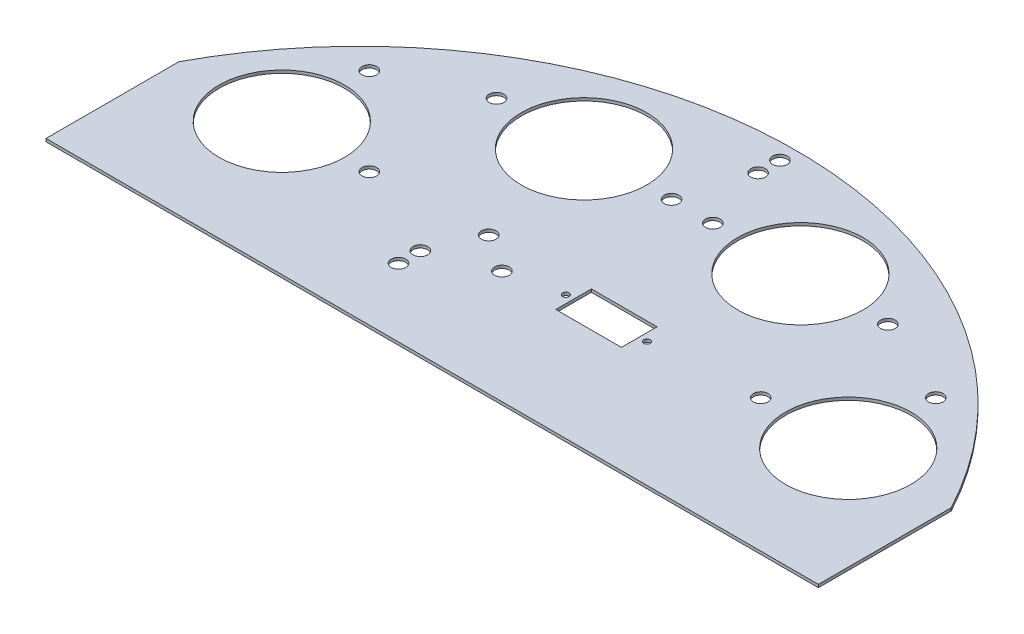
ISO-10303-21;
HEADER;
FILE_DESCRIPTION(('STEP AP214'),'2;1');
FILE_NAME('part.step','',(''),(''),'','','');
FILE_SCHEMA(('AUTOMOTIVE_DESIGN { 1 0 10303 214 1 1 1 1 }'));
ENDSEC;
DATA;
#1=APPLICATION_CONTEXT('core data for automotive mechanical design processes');
#2=APPLICATION_PROTOCOL_DEFINITION('international standard','automotive_design',2000,#1);
#3=PRODUCT_CONTEXT('',#1,'mechanical');
#4=PRODUCT('Part','Part','',(#3));
#5=PRODUCT_RELATED_PRODUCT_CATEGORY('part','',(#4));
#6=PRODUCT_DEFINITION_FORMATION('','',#4);
#7=PRODUCT_DEFINITION_CONTEXT('part definition',#1,'design');
#8=PRODUCT_DEFINITION('design','',#6,#7);
#9=PRODUCT_DEFINITION_SHAPE('','',#8);
#10=(LENGTH_UNIT() NAMED_UNIT(*) SI_UNIT(.MILLI.,.METRE.));
#11=(NAMED_UNIT(*) PLANE_ANGLE_UNIT() SI_UNIT($,.RADIAN.));
#12=(NAMED_UNIT(*) SI_UNIT($,.STERADIAN.) SOLID_ANGLE_UNIT());
#13=UNCERTAINTY_MEASURE_WITH_UNIT(LENGTH_MEASURE(1.E-05),#10,'distance_accuracy_value','');
#14=(GEOMETRIC_REPRESENTATION_CONTEXT(3) GLOBAL_UNCERTAINTY_ASSIGNED_CONTEXT((#13)) GLOBAL_UNIT_ASSIGNED_CONTEXT((#10,
#11,#12)) REPRESENTATION_CONTEXT('',''));
#15=CARTESIAN_POINT('',(0.,0.,0.));
#16=DIRECTION('',(0.,0.,1.));
#17=DIRECTION('',(1.,0.,0.));
#18=AXIS2_PLACEMENT_3D('',#15,#16,#17);
#19=CARTESIAN_POINT('',(0.,0.,0.));
#20=DIRECTION('',(0.,1.,0.));
#21=DIRECTION('',(0.,0.,1.));
#22=AXIS2_PLACEMENT_3D('',#19,#20,#21);
#23=PLANE('',#22);
#24=CARTESIAN_POINT('',(3.27642308215726,0.,-23.7231603295577));
#25=DIRECTION('',(0.,-1.,0.));
#26=DIRECTION('',(0.,0.,-1.));
#27=AXIS2_PLACEMENT_3D('',#24,#25,#26);
#28=CIRCLE('',#27,1.1);
#29=CARTESIAN_POINT('',(3.27642308215726,0.,-24.8231603295577));
#30=VERTEX_POINT('',#29);
#31=EDGE_CURVE('E121',#30,#30,#28,.T.);
#32=ORIENTED_EDGE('',*,*,#31,.F.);
#33=EDGE_LOOP('',(#32));
#34=FACE_BOUND('',#33,.T.);
#35=CARTESIAN_POINT('',(31.0764230821573,0.,-23.7231603295648));
#36=DIRECTION('',(0.,-1.,0.));
#37=DIRECTION('',(0.,0.,-1.));
#38=AXIS2_PLACEMENT_3D('',#35,#36,#37);
#39=CIRCLE('',#38,1.1);
#40=CARTESIAN_POINT('',(31.0764230821573,0.,-24.8231603295648));
#41=VERTEX_POINT('',#40);
#42=EDGE_CURVE('E536',#41,#41,#39,.T.);
#43=ORIENTED_EDGE('',*,*,#42,.F.);
#44=EDGE_LOOP('',(#43));
#45=FACE_BOUND('',#44,.T.);
#46=CARTESIAN_POINT('',(0.0264230821546131,0.,-100.361328531609));
#47=DIRECTION('',(0.,-1.,0.));
#48=DIRECTION('',(0.,0.,-1.));
#49=AXIS2_PLACEMENT_3D('',#46,#47,#48);
#50=CIRCLE('',#49,2.5);
#51=CARTESIAN_POINT('',(0.0264230821546131,0.,-102.861328531609));
#52=VERTEX_POINT('',#51);
#53=EDGE_CURVE('E530',#52,#52,#50,.T.);
#54=ORIENTED_EDGE('',*,*,#53,.F.);
#55=EDGE_LOOP('',(#54));
#56=FACE_BOUND('',#55,.T.);
#57=CARTESIAN_POINT('',(0.0313088597263741,0.,-92.861330122997));
#58=DIRECTION('',(0.,-1.,0.));
#59=DIRECTION('',(0.,0.,-1.));
#60=AXIS2_PLACEMENT_3D('',#57,#58,#59);
#61=CIRCLE('',#60,2.5);
#62=CARTESIAN_POINT('',(0.0313088597263741,0.,-95.361330122997));
#63=VERTEX_POINT('',#62);
#64=EDGE_CURVE('E524',#63,#63,#61,.T.);
#65=ORIENTED_EDGE('',*,*,#64,.F.);
#66=EDGE_LOOP('',(#65));
#67=FACE_BOUND('',#66,.T.);
#68=CARTESIAN_POINT('',(-34.7470971556567,0.,-4.37316032956778));
#69=DIRECTION('',(0.,-1.,0.));
#70=DIRECTION('',(0.,0.,-1.));
#71=AXIS2_PLACEMENT_3D('',#68,#69,#70);
#72=CIRCLE('',#71,2.49999999999871);
#73=CARTESIAN_POINT('',(-34.7470971556567,0.,-6.87316032956649));
#74=VERTEX_POINT('',#73);
#75=EDGE_CURVE('E518',#74,#74,#72,.T.);
#76=ORIENTED_EDGE('',*,*,#75,.F.);
#77=EDGE_LOOP('',(#76));
#78=FACE_BOUND('',#77,.T.);
#79=CARTESIAN_POINT('',(-34.7470971556569,0.,-11.8731603295678));
#80=DIRECTION('',(0.,-1.,0.));
#81=DIRECTION('',(0.,0.,-1.));
#82=AXIS2_PLACEMENT_3D('',#79,#80,#81);
#83=CIRCLE('',#82,2.49999999999872);
#84=CARTESIAN_POINT('',(-34.7470971556569,0.,-14.3731603295665));
#85=VERTEX_POINT('',#84);
#86=EDGE_CURVE('E512',#85,#85,#83,.T.);
#87=ORIENTED_EDGE('',*,*,#86,.F.);
#88=EDGE_LOOP('',(#87));
#89=FACE_BOUND('',#88,.T.);
#90=CARTESIAN_POINT('',(-14.7000794528065,0.,-19.7948636798147));
#91=DIRECTION('',(0.,-1.,0.));
#92=DIRECTION('',(0.,0.,-1.));
#93=AXIS2_PLACEMENT_3D('',#90,#91,#92);
#94=CIRCLE('',#93,2.5);
#95=CARTESIAN_POINT('',(-14.7000794528065,0.,-22.2948636798147));
#96=VERTEX_POINT('',#95);
#97=EDGE_CURVE('E504',#96,#96,#94,.T.);
#98=ORIENTED_EDGE('',*,*,#97,.F.);
#99=EDGE_LOOP('',(#98));
#100=FACE_BOUND('',#99,.T.);
#101=CARTESIAN_POINT('',(-27.6878652168352,0.,-28.2546166873023));
#102=DIRECTION('',(0.,-1.,0.));
#103=DIRECTION('',(0.,0.,-1.));
#104=AXIS2_PLACEMENT_3D('',#101,#102,#103);
#105=CIRCLE('',#104,2.5);
#106=CARTESIAN_POINT('',(-27.6878652168352,0.,-30.7546166873023));
#107=VERTEX_POINT('',#106);
#108=EDGE_CURVE('E498',#107,#107,#105,.T.);
#109=ORIENTED_EDGE('',*,*,#108,.F.);
#110=EDGE_LOOP('',(#109));
#111=FACE_BOUND('',#110,.T.);
#112=CARTESIAN_POINT('',(97.237534512333,0.,-56.561617597691));
#113=DIRECTION('',(0.,-1.,0.));
#114=DIRECTION('',(0.,0.,-1.));
#115=AXIS2_PLACEMENT_3D('',#112,#113,#114);
#116=CIRCLE('',#115,2.49999999999999);
#117=CARTESIAN_POINT('',(97.237534512333,0.,-59.061617597691));
#118=VERTEX_POINT('',#117);
#119=EDGE_CURVE('E134',#118,#118,#116,.T.);
#120=ORIENTED_EDGE('',*,*,#119,.F.);
#121=EDGE_LOOP('',(#120));
#122=FACE_BOUND('',#121,.T.);
#123=CARTESIAN_POINT('',(97.237534512333,0.,-26.561617597691));
#124=DIRECTION('',(0.,1.,0.));
#125=DIRECTION('',(0.,0.,1.));
#126=AXIS2_PLACEMENT_3D('',#123,#124,#125);
#127=CIRCLE('',#126,21.5);
#128=CARTESIAN_POINT('',(97.237534512333,0.,-5.06161759769103));
#129=VERTEX_POINT('',#128);
#130=EDGE_CURVE('E189',#129,#129,#127,.T.);
#131=ORIENTED_EDGE('',*,*,#130,.T.);
#132=EDGE_LOOP('',(#131));
#133=FACE_BOUND('',#132,.T.);
#134=CARTESIAN_POINT('',(37.2375345123306,0.,-70.1541692780098));
#135=DIRECTION('',(0.,1.,0.));
#136=DIRECTION('',(0.,0.,1.));
#137=AXIS2_PLACEMENT_3D('',#134,#135,#136);
#138=CIRCLE('',#137,21.5);
#139=CARTESIAN_POINT('',(37.2375345123306,0.,-48.6541692780098));
#140=VERTEX_POINT('',#139);
#141=EDGE_CURVE('E226',#140,#140,#138,.T.);
#142=ORIENTED_EDGE('',*,*,#141,.T.);
#143=EDGE_LOOP('',(#142));
#144=FACE_BOUND('',#143,.T.);
#145=CARTESIAN_POINT('',(-36.926544137657,0.,-70.1541692780059));
#146=DIRECTION('',(0.,1.,0.));
#147=DIRECTION('',(0.,0.,1.));
#148=AXIS2_PLACEMENT_3D('',#145,#146,#147);
#149=CIRCLE('',#148,21.5);
#150=CARTESIAN_POINT('',(-36.926544137657,0.,-48.6541692780059));
#151=VERTEX_POINT('',#150);
#152=EDGE_CURVE('E223',#151,#151,#149,.T.);
#153=ORIENTED_EDGE('',*,*,#152,.T.);
#154=EDGE_LOOP('',(#153));
#155=FACE_BOUND('',#154,.T.);
#156=CARTESIAN_POINT('',(-96.9265441376548,0.,-26.5616175976809));
#157=DIRECTION('',(0.,1.,0.));
#158=DIRECTION('',(0.,0.,1.));
#159=AXIS2_PLACEMENT_3D('',#156,#157,#158);
#160=CIRCLE('',#159,21.5);
#161=CARTESIAN_POINT('',(-96.9265441376548,0.,-5.0616175976809));
#162=VERTEX_POINT('',#161);
#163=EDGE_CURVE('E220',#162,#162,#160,.T.);
#164=ORIENTED_EDGE('',*,*,#163,.T.);
#165=EDGE_LOOP('',(#164));
#166=FACE_BOUND('',#165,.T.);
#167=DIRECTION('',(0.,0.,1.));
#168=VECTOR('',#167,1.);
#169=CARTESIAN_POINT('',(-132.226234516957,0.,0.));
#170=LINE('',#169,#168);
#171=CARTESIAN_POINT('',(-132.226234516957,0.,-26.5616175976809));
#172=VERTEX_POINT('',#171);
#173=CARTESIAN_POINT('',(-132.226234516957,0.,18.9726126774052));
#174=VERTEX_POINT('',#173);
#175=EDGE_CURVE('E185',#172,#174,#170,.T.);
#176=ORIENTED_EDGE('',*,*,#175,.F.);
#177=CARTESIAN_POINT('',(0.155495187338843,0.,43.9726126774052));
#178=DIRECTION('',(0.,1.,0.));
#179=DIRECTION('',(0.,0.,1.));
#180=AXIS2_PLACEMENT_3D('',#177,#178,#179);
#181=CIRCLE('',#180,150.);
#182=CARTESIAN_POINT('',(132.537224891629,0.,-26.561617597691));
#183=VERTEX_POINT('',#182);
#184=EDGE_CURVE('E218',#183,#172,#181,.T.);
#185=ORIENTED_EDGE('',*,*,#184,.F.);
#186=DIRECTION('',(0.,0.,1.));
#187=VECTOR('',#186,1.);
#188=CARTESIAN_POINT('',(132.537224891629,0.,0.));
#189=LINE('',#188,#187);
#190=CARTESIAN_POINT('',(132.537224891629,0.,18.9726126774052));
#191=VERTEX_POINT('',#190);
#192=EDGE_CURVE('E215',#183,#191,#189,.T.);
#193=ORIENTED_EDGE('',*,*,#192,.T.);
#194=DIRECTION('',(-1.,0.,0.));
#195=VECTOR('',#194,1.);
#196=CARTESIAN_POINT('',(0.,0.,18.9726126774052));
#197=LINE('',#196,#195);
#198=EDGE_CURVE('E212',#191,#174,#197,.T.);
#199=ORIENTED_EDGE('',*,*,#198,.T.);
#200=EDGE_LOOP('',(#176,#185,#193,#199));
#201=FACE_BOUND('',#200,.T.);
#202=CARTESIAN_POINT('',(-66.9265441376548,0.,-26.561617597691));
#203=DIRECTION('',(0.,-1.,0.));
#204=DIRECTION('',(0.,0.,-1.));
#205=AXIS2_PLACEMENT_3D('',#202,#203,#204);
#206=CIRCLE('',#205,2.49999999999999);
#207=CARTESIAN_POINT('',(-66.9265441376548,0.,-29.061617597691));
#208=VERTEX_POINT('',#207);
#209=EDGE_CURVE('E179',#208,#208,#206,.T.);
#210=ORIENTED_EDGE('',*,*,#209,.F.);
#211=EDGE_LOOP('',(#210));
#212=FACE_BOUND('',#211,.T.);
#213=CARTESIAN_POINT('',(-96.9265441376548,0.,-56.5616175976809));
#214=DIRECTION('',(0.,-1.,0.));
#215=DIRECTION('',(0.,0.,-1.));
#216=AXIS2_PLACEMENT_3D('',#213,#214,#215);
#217=CIRCLE('',#216,2.49999999999999);
#218=CARTESIAN_POINT('',(-96.9265441376548,0.,-59.0616175976809));
#219=VERTEX_POINT('',#218);
#220=EDGE_CURVE('E173',#219,#219,#217,.T.);
#221=ORIENTED_EDGE('',*,*,#220,.F.);
#222=EDGE_LOOP('',(#221));
#223=FACE_BOUND('',#222,.T.);
#224=CARTESIAN_POINT('',(-66.926544137657,0.,-70.1541692780059));
#225=DIRECTION('',(0.,-1.,0.));
#226=DIRECTION('',(0.,0.,-1.));
#227=AXIS2_PLACEMENT_3D('',#224,#225,#226);
#228=CIRCLE('',#227,2.49999999999999);
#229=CARTESIAN_POINT('',(-66.926544137657,0.,-72.6541692780059));
#230=VERTEX_POINT('',#229);
#231=EDGE_CURVE('E167',#230,#230,#228,.T.);
#232=ORIENTED_EDGE('',*,*,#231,.F.);
#233=EDGE_LOOP('',(#232));
#234=FACE_BOUND('',#233,.T.);
#235=CARTESIAN_POINT('',(-6.92654413765696,0.,-70.1541692780059));
#236=DIRECTION('',(0.,-1.,0.));
#237=DIRECTION('',(0.,0.,-1.));
#238=AXIS2_PLACEMENT_3D('',#235,#236,#237);
#239=CIRCLE('',#238,2.49999999999999);
#240=CARTESIAN_POINT('',(-6.92654413765696,0.,-72.6541692780059));
#241=VERTEX_POINT('',#240);
#242=EDGE_CURVE('E161',#241,#241,#239,.T.);
#243=ORIENTED_EDGE('',*,*,#242,.F.);
#244=EDGE_LOOP('',(#243));
#245=FACE_BOUND('',#244,.T.);
#246=CARTESIAN_POINT('',(7.23753451233063,0.,-70.1541692780059));
#247=DIRECTION('',(0.,-1.,0.));
#248=DIRECTION('',(0.,0.,-1.));
#249=AXIS2_PLACEMENT_3D('',#246,#247,#248);
#250=CIRCLE('',#249,2.49999999999999);
#251=CARTESIAN_POINT('',(7.23753451233063,0.,-72.6541692780059));
#252=VERTEX_POINT('',#251);
#253=EDGE_CURVE('E155',#252,#252,#250,.T.);
#254=ORIENTED_EDGE('',*,*,#253,.F.);
#255=EDGE_LOOP('',(#254));
#256=FACE_BOUND('',#255,.T.);
#257=CARTESIAN_POINT('',(67.2375345123306,0.,-70.1541692780059));
#258=DIRECTION('',(0.,-1.,0.));
#259=DIRECTION('',(0.,0.,-1.));
#260=AXIS2_PLACEMENT_3D('',#257,#258,#259);
#261=CIRCLE('',#260,2.49999999999999);
#262=CARTESIAN_POINT('',(67.2375345123306,0.,-72.6541692780059));
#263=VERTEX_POINT('',#262);
#264=EDGE_CURVE('E149',#263,#263,#261,.T.);
#265=ORIENTED_EDGE('',*,*,#264,.F.);
#266=EDGE_LOOP('',(#265));
#267=FACE_BOUND('',#266,.T.);
#268=CARTESIAN_POINT('',(67.237534512333,0.,-26.561617597691));
#269=DIRECTION('',(0.,-1.,0.));
#270=DIRECTION('',(0.,0.,-1.));
#271=AXIS2_PLACEMENT_3D('',#268,#269,#270);
#272=CIRCLE('',#271,2.49999999999999);
#273=CARTESIAN_POINT('',(67.237534512333,0.,-29.061617597691));
#274=VERTEX_POINT('',#273);
#275=EDGE_CURVE('E143',#274,#274,#272,.T.);
#276=ORIENTED_EDGE('',*,*,#275,.F.);
#277=EDGE_LOOP('',(#276));
#278=FACE_BOUND('',#277,.T.);
#279=DIRECTION('',(1.,0.,0.));
#280=VECTOR('',#279,1.);
#281=CARTESIAN_POINT('',(0.,0.,-17.6231603295639));
#282=LINE('',#281,#280);
#283=CARTESIAN_POINT('',(5.92642308215861,0.,-17.6231603295639));
#284=VERTEX_POINT('',#283);
#285=CARTESIAN_POINT('',(28.4264230821559,0.,-17.6231603295639));
#286=VERTEX_POINT('',#285);
#287=EDGE_CURVE('E50',#284,#286,#282,.T.);
#288=ORIENTED_EDGE('',*,*,#287,.T.);
#289=DIRECTION('',(0.,0.,-1.));
#290=VECTOR('',#289,1.);
#291=CARTESIAN_POINT('',(28.4264230821559,0.,0.));
#292=LINE('',#291,#290);
#293=CARTESIAN_POINT('',(28.4264230821559,0.,-29.8231603295586));
#294=VERTEX_POINT('',#293);
#295=EDGE_CURVE('E115',#286,#294,#292,.T.);
#296=ORIENTED_EDGE('',*,*,#295,.T.);
#297=DIRECTION('',(-1.,0.,0.));
#298=VECTOR('',#297,1.);
#299=CARTESIAN_POINT('',(0.,0.,-29.8231603295586));
#300=LINE('',#299,#298);
#301=CARTESIAN_POINT('',(5.92642308215861,0.,-29.8231603295586));
#302=VERTEX_POINT('',#301);
#303=EDGE_CURVE('E118',#294,#302,#300,.T.);
#304=ORIENTED_EDGE('',*,*,#303,.T.);
#305=DIRECTION('',(0.,0.,1.));
#306=VECTOR('',#305,1.);
#307=CARTESIAN_POINT('',(5.92642308215861,0.,0.));
#308=LINE('',#307,#306);
#309=EDGE_CURVE('E127',#302,#284,#308,.T.);
#310=ORIENTED_EDGE('',*,*,#309,.T.);
#311=EDGE_LOOP('',(#288,#296,#304,#310));
#312=FACE_BOUND('',#311,.T.);
#313=ADVANCED_FACE('F35',(#34,#45,#56,#67,#78,#89,#100,#111,#122,#133,#144,#155,#166,#201,#212,
#223,#234,#245,#256,#267,#278,#312),#23,.F.);
#314=CARTESIAN_POINT('',(0.,1.,0.));
#315=DIRECTION('',(0.,1.,0.));
#316=DIRECTION('',(0.,0.,1.));
#317=AXIS2_PLACEMENT_3D('',#314,#315,#316);
#318=PLANE('',#317);
#319=CARTESIAN_POINT('',(3.27642308215726,1.,-23.7231603295577));
#320=DIRECTION('',(0.,-1.,0.));
#321=DIRECTION('',(0.,0.,-1.));
#322=AXIS2_PLACEMENT_3D('',#319,#320,#321);
#323=CIRCLE('',#322,1.1);
#324=CARTESIAN_POINT('',(3.27642308215726,1.,-24.8231603295577));
#325=VERTEX_POINT('',#324);
#326=EDGE_CURVE('E538',#325,#325,#323,.T.);
#327=ORIENTED_EDGE('',*,*,#326,.T.);
#328=EDGE_LOOP('',(#327));
#329=FACE_BOUND('',#328,.T.);
#330=CARTESIAN_POINT('',(31.0764230821573,1.,-23.7231603295648));
#331=DIRECTION('',(0.,-1.,0.));
#332=DIRECTION('',(0.,0.,-1.));
#333=AXIS2_PLACEMENT_3D('',#330,#331,#332);
#334=CIRCLE('',#333,1.1);
#335=CARTESIAN_POINT('',(31.0764230821573,1.,-24.8231603295648));
#336=VERTEX_POINT('',#335);
#337=EDGE_CURVE('E533',#336,#336,#334,.T.);
#338=ORIENTED_EDGE('',*,*,#337,.T.);
#339=EDGE_LOOP('',(#338));
#340=FACE_BOUND('',#339,.T.);
#341=CARTESIAN_POINT('',(0.0264230821546131,1.,-100.361328531609));
#342=DIRECTION('',(0.,-1.,0.));
#343=DIRECTION('',(0.,0.,-1.));
#344=AXIS2_PLACEMENT_3D('',#341,#342,#343);
#345=CIRCLE('',#344,2.5);
#346=CARTESIAN_POINT('',(0.0264230821546131,1.,-102.861328531609));
#347=VERTEX_POINT('',#346);
#348=EDGE_CURVE('E527',#347,#347,#345,.T.);
#349=ORIENTED_EDGE('',*,*,#348,.T.);
#350=EDGE_LOOP('',(#349));
#351=FACE_BOUND('',#350,.T.);
#352=CARTESIAN_POINT('',(0.0313088597263741,1.,-92.861330122997));
#353=DIRECTION('',(0.,-1.,0.));
#354=DIRECTION('',(0.,0.,-1.));
#355=AXIS2_PLACEMENT_3D('',#352,#353,#354);
#356=CIRCLE('',#355,2.5);
#357=CARTESIAN_POINT('',(0.0313088597263741,1.,-95.361330122997));
#358=VERTEX_POINT('',#357);
#359=EDGE_CURVE('E521',#358,#358,#356,.T.);
#360=ORIENTED_EDGE('',*,*,#359,.T.);
#361=EDGE_LOOP('',(#360));
#362=FACE_BOUND('',#361,.T.);
#363=CARTESIAN_POINT('',(-34.7470971556567,1.,-4.37316032956778));
#364=DIRECTION('',(0.,-1.,0.));
#365=DIRECTION('',(0.,0.,-1.));
#366=AXIS2_PLACEMENT_3D('',#363,#364,#365);
#367=CIRCLE('',#366,2.49999999999871);
#368=CARTESIAN_POINT('',(-34.7470971556567,1.,-6.87316032956649));
#369=VERTEX_POINT('',#368);
#370=EDGE_CURVE('E515',#369,#369,#367,.T.);
#371=ORIENTED_EDGE('',*,*,#370,.T.);
#372=EDGE_LOOP('',(#371));
#373=FACE_BOUND('',#372,.T.);
#374=CARTESIAN_POINT('',(-34.7470971556569,1.,-11.8731603295678));
#375=DIRECTION('',(0.,-1.,0.));
#376=DIRECTION('',(0.,0.,-1.));
#377=AXIS2_PLACEMENT_3D('',#374,#375,#376);
#378=CIRCLE('',#377,2.49999999999872);
#379=CARTESIAN_POINT('',(-34.7470971556569,1.,-14.3731603295665));
#380=VERTEX_POINT('',#379);
#381=EDGE_CURVE('E509',#380,#380,#378,.T.);
#382=ORIENTED_EDGE('',*,*,#381,.T.);
#383=EDGE_LOOP('',(#382));
#384=FACE_BOUND('',#383,.T.);
#385=CARTESIAN_POINT('',(-14.7000794528065,1.,-19.7948636798147));
#386=DIRECTION('',(0.,-1.,0.));
#387=DIRECTION('',(0.,0.,-1.));
#388=AXIS2_PLACEMENT_3D('',#385,#386,#387);
#389=CIRCLE('',#388,2.5);
#390=CARTESIAN_POINT('',(-14.7000794528065,1.,-22.2948636798147));
#391=VERTEX_POINT('',#390);
#392=EDGE_CURVE('E500',#391,#391,#389,.T.);
#393=ORIENTED_EDGE('',*,*,#392,.T.);
#394=EDGE_LOOP('',(#393));
#395=FACE_BOUND('',#394,.T.);
#396=CARTESIAN_POINT('',(-27.6878652168352,1.,-28.2546166873023));
#397=DIRECTION('',(0.,-1.,0.));
#398=DIRECTION('',(0.,0.,-1.));
#399=AXIS2_PLACEMENT_3D('',#396,#397,#398);
#400=CIRCLE('',#399,2.5);
#401=CARTESIAN_POINT('',(-27.6878652168352,1.,-30.7546166873023));
#402=VERTEX_POINT('',#401);
#403=EDGE_CURVE('E128',#402,#402,#400,.T.);
#404=ORIENTED_EDGE('',*,*,#403,.T.);
#405=EDGE_LOOP('',(#404));
#406=FACE_BOUND('',#405,.T.);
#407=CARTESIAN_POINT('',(97.237534512333,1.,-56.561617597691));
#408=DIRECTION('',(0.,-1.,0.));
#409=DIRECTION('',(0.,0.,-1.));
#410=AXIS2_PLACEMENT_3D('',#407,#408,#409);
#411=CIRCLE('',#410,2.5);
#412=CARTESIAN_POINT('',(97.237534512333,1.,-59.061617597691));
#413=VERTEX_POINT('',#412);
#414=EDGE_CURVE('E140',#413,#413,#411,.T.);
#415=ORIENTED_EDGE('',*,*,#414,.T.);
#416=EDGE_LOOP('',(#415));
#417=FACE_BOUND('',#416,.T.);
#418=CARTESIAN_POINT('',(67.237534512333,1.,-26.561617597691));
#419=DIRECTION('',(0.,-1.,0.));
#420=DIRECTION('',(0.,0.,-1.));
#421=AXIS2_PLACEMENT_3D('',#418,#419,#420);
#422=CIRCLE('',#421,2.5);
#423=CARTESIAN_POINT('',(67.237534512333,1.,-29.061617597691));
#424=VERTEX_POINT('',#423);
#425=EDGE_CURVE('E146',#424,#424,#422,.T.);
#426=ORIENTED_EDGE('',*,*,#425,.T.);
#427=EDGE_LOOP('',(#426));
#428=FACE_BOUND('',#427,.T.);
#429=CARTESIAN_POINT('',(67.2375345123306,1.,-70.1541692780059));
#430=DIRECTION('',(0.,-1.,0.));
#431=DIRECTION('',(0.,0.,-1.));
#432=AXIS2_PLACEMENT_3D('',#429,#430,#431);
#433=CIRCLE('',#432,2.5);
#434=CARTESIAN_POINT('',(67.2375345123306,1.,-72.6541692780059));
#435=VERTEX_POINT('',#434);
#436=EDGE_CURVE('E152',#435,#435,#433,.T.);
#437=ORIENTED_EDGE('',*,*,#436,.T.);
#438=EDGE_LOOP('',(#437));
#439=FACE_BOUND('',#438,.T.);
#440=CARTESIAN_POINT('',(7.23753451233063,1.,-70.1541692780059));
#441=DIRECTION('',(0.,-1.,0.));
#442=DIRECTION('',(0.,0.,-1.));
#443=AXIS2_PLACEMENT_3D('',#440,#441,#442);
#444=CIRCLE('',#443,2.5);
#445=CARTESIAN_POINT('',(7.23753451233063,1.,-72.6541692780059));
#446=VERTEX_POINT('',#445);
#447=EDGE_CURVE('E158',#446,#446,#444,.T.);
#448=ORIENTED_EDGE('',*,*,#447,.T.);
#449=EDGE_LOOP('',(#448));
#450=FACE_BOUND('',#449,.T.);
#451=CARTESIAN_POINT('',(-6.92654413765696,1.,-70.1541692780059));
#452=DIRECTION('',(0.,-1.,0.));
#453=DIRECTION('',(0.,0.,-1.));
#454=AXIS2_PLACEMENT_3D('',#451,#452,#453);
#455=CIRCLE('',#454,2.5);
#456=CARTESIAN_POINT('',(-6.92654413765696,1.,-72.6541692780059));
#457=VERTEX_POINT('',#456);
#458=EDGE_CURVE('E164',#457,#457,#455,.T.);
#459=ORIENTED_EDGE('',*,*,#458,.T.);
#460=EDGE_LOOP('',(#459));
#461=FACE_BOUND('',#460,.T.);
#462=CARTESIAN_POINT('',(-66.926544137657,1.,-70.1541692780059));
#463=DIRECTION('',(0.,-1.,0.));
#464=DIRECTION('',(0.,0.,-1.));
#465=AXIS2_PLACEMENT_3D('',#462,#463,#464);
#466=CIRCLE('',#465,2.5);
#467=CARTESIAN_POINT('',(-66.926544137657,1.,-72.6541692780059));
#468=VERTEX_POINT('',#467);
#469=EDGE_CURVE('E170',#468,#468,#466,.T.);
#470=ORIENTED_EDGE('',*,*,#469,.T.);
#471=EDGE_LOOP('',(#470));
#472=FACE_BOUND('',#471,.T.);
#473=CARTESIAN_POINT('',(-96.9265441376548,1.,-56.5616175976809));
#474=DIRECTION('',(0.,-1.,0.));
#475=DIRECTION('',(0.,0.,-1.));
#476=AXIS2_PLACEMENT_3D('',#473,#474,#475);
#477=CIRCLE('',#476,2.5);
#478=CARTESIAN_POINT('',(-96.9265441376548,1.,-59.0616175976809));
#479=VERTEX_POINT('',#478);
#480=EDGE_CURVE('E176',#479,#479,#477,.T.);
#481=ORIENTED_EDGE('',*,*,#480,.T.);
#482=EDGE_LOOP('',(#481));
#483=FACE_BOUND('',#482,.T.);
#484=CARTESIAN_POINT('',(-66.9265441376548,1.,-26.561617597691));
#485=DIRECTION('',(0.,-1.,0.));
#486=DIRECTION('',(0.,0.,-1.));
#487=AXIS2_PLACEMENT_3D('',#484,#485,#486);
#488=CIRCLE('',#487,2.5);
#489=CARTESIAN_POINT('',(-66.9265441376548,1.,-29.061617597691));
#490=VERTEX_POINT('',#489);
#491=EDGE_CURVE('E182',#490,#490,#488,.T.);
#492=ORIENTED_EDGE('',*,*,#491,.T.);
#493=EDGE_LOOP('',(#492));
#494=FACE_BOUND('',#493,.T.);
#495=DIRECTION('',(0.,0.,1.));
#496=VECTOR('',#495,1.);
#497=CARTESIAN_POINT('',(-132.226234516957,1.,0.));
#498=LINE('',#497,#496);
#499=CARTESIAN_POINT('',(-132.226234516957,1.,-26.5616175976809));
#500=VERTEX_POINT('',#499);
#501=CARTESIAN_POINT('',(-132.226234516957,1.,18.9726126774052));
#502=VERTEX_POINT('',#501);
#503=EDGE_CURVE('E186',#500,#502,#498,.T.);
#504=ORIENTED_EDGE('',*,*,#503,.T.);
#505=DIRECTION('',(-1.,0.,0.));
#506=VECTOR('',#505,1.);
#507=CARTESIAN_POINT('',(0.,1.,18.9726126774052));
#508=LINE('',#507,#506);
#509=CARTESIAN_POINT('',(132.537224891629,1.,18.9726126774052));
#510=VERTEX_POINT('',#509);
#511=EDGE_CURVE('E188',#510,#502,#508,.T.);
#512=ORIENTED_EDGE('',*,*,#511,.F.);
#513=DIRECTION('',(0.,0.,1.));
#514=VECTOR('',#513,1.);
#515=CARTESIAN_POINT('',(132.537224891629,1.,0.));
#516=LINE('',#515,#514);
#517=CARTESIAN_POINT('',(132.537224891629,1.,-26.561617597691));
#518=VERTEX_POINT('',#517);
#519=EDGE_CURVE('E192',#518,#510,#516,.T.);
#520=ORIENTED_EDGE('',*,*,#519,.F.);
#521=CARTESIAN_POINT('',(0.155495187338843,1.,43.9726126774052));
#522=DIRECTION('',(0.,1.,0.));
#523=DIRECTION('',(0.,0.,1.));
#524=AXIS2_PLACEMENT_3D('',#521,#522,#523);
#525=CIRCLE('',#524,150.);
#526=EDGE_CURVE('E195',#518,#500,#525,.T.);
#527=ORIENTED_EDGE('',*,*,#526,.T.);
#528=EDGE_LOOP('',(#504,#512,#520,#527));
#529=FACE_BOUND('',#528,.T.);
#530=CARTESIAN_POINT('',(-96.9265441376548,1.,-26.5616175976809));
#531=DIRECTION('',(0.,1.,0.));
#532=DIRECTION('',(0.,0.,1.));
#533=AXIS2_PLACEMENT_3D('',#530,#531,#532);
#534=CIRCLE('',#533,21.5);
#535=CARTESIAN_POINT('',(-96.9265441376548,1.,-5.0616175976809));
#536=VERTEX_POINT('',#535);
#537=EDGE_CURVE('E197',#536,#536,#534,.T.);
#538=ORIENTED_EDGE('',*,*,#537,.F.);
#539=EDGE_LOOP('',(#538));
#540=FACE_BOUND('',#539,.T.);
#541=CARTESIAN_POINT('',(-36.926544137657,1.,-70.1541692780059));
#542=DIRECTION('',(0.,1.,0.));
#543=DIRECTION('',(0.,0.,1.));
#544=AXIS2_PLACEMENT_3D('',#541,#542,#543);
#545=CIRCLE('',#544,21.5);
#546=CARTESIAN_POINT('',(-36.926544137657,1.,-48.6541692780059));
#547=VERTEX_POINT('',#546);
#548=EDGE_CURVE('E200',#547,#547,#545,.T.);
#549=ORIENTED_EDGE('',*,*,#548,.F.);
#550=EDGE_LOOP('',(#549));
#551=FACE_BOUND('',#550,.T.);
#552=CARTESIAN_POINT('',(37.2375345123306,1.,-70.1541692780098));
#553=DIRECTION('',(0.,1.,0.));
#554=DIRECTION('',(0.,0.,1.));
#555=AXIS2_PLACEMENT_3D('',#552,#553,#554);
#556=CIRCLE('',#555,21.5);
#557=CARTESIAN_POINT('',(37.2375345123306,1.,-48.6541692780098));
#558=VERTEX_POINT('',#557);
#559=EDGE_CURVE('E203',#558,#558,#556,.T.);
#560=ORIENTED_EDGE('',*,*,#559,.F.);
#561=EDGE_LOOP('',(#560));
#562=FACE_BOUND('',#561,.T.);
#563=CARTESIAN_POINT('',(97.237534512333,1.,-26.561617597691));
#564=DIRECTION('',(0.,1.,0.));
#565=DIRECTION('',(0.,0.,1.));
#566=AXIS2_PLACEMENT_3D('',#563,#564,#565);
#567=CIRCLE('',#566,21.5);
#568=CARTESIAN_POINT('',(97.237534512333,1.,-5.06161759769103));
#569=VERTEX_POINT('',#568);
#570=EDGE_CURVE('E206',#569,#569,#567,.T.);
#571=ORIENTED_EDGE('',*,*,#570,.F.);
#572=EDGE_LOOP('',(#571));
#573=FACE_BOUND('',#572,.T.);
#574=DIRECTION('',(0.,0.,-1.));
#575=VECTOR('',#574,1.);
#576=CARTESIAN_POINT('',(28.4264230821559,1.,0.));
#577=LINE('',#576,#575);
#578=CARTESIAN_POINT('',(28.4264230821559,1.,-17.6231603295639));
#579=VERTEX_POINT('',#578);
#580=CARTESIAN_POINT('',(28.4264230821559,1.,-29.8231603295586));
#581=VERTEX_POINT('',#580);
#582=EDGE_CURVE('E111',#579,#581,#577,.T.);
#583=ORIENTED_EDGE('',*,*,#582,.F.);
#584=DIRECTION('',(1.,0.,0.));
#585=VECTOR('',#584,1.);
#586=CARTESIAN_POINT('',(0.,1.,-17.6231603295639));
#587=LINE('',#586,#585);
#588=CARTESIAN_POINT('',(5.92642308215861,1.,-17.6231603295639));
#589=VERTEX_POINT('',#588);
#590=EDGE_CURVE('E107',#589,#579,#587,.T.);
#591=ORIENTED_EDGE('',*,*,#590,.F.);
#592=DIRECTION('',(0.,0.,1.));
#593=VECTOR('',#592,1.);
#594=CARTESIAN_POINT('',(5.92642308215861,1.,0.));
#595=LINE('',#594,#593);
#596=CARTESIAN_POINT('',(5.92642308215861,1.,-29.8231603295586));
#597=VERTEX_POINT('',#596);
#598=EDGE_CURVE('E99',#597,#589,#595,.T.);
#599=ORIENTED_EDGE('',*,*,#598,.F.);
#600=DIRECTION('',(-1.,0.,0.));
#601=VECTOR('',#600,1.);
#602=CARTESIAN_POINT('',(0.,1.,-29.8231603295586));
#603=LINE('',#602,#601);
#604=EDGE_CURVE('E106',#581,#597,#603,.T.);
#605=ORIENTED_EDGE('',*,*,#604,.F.);
#606=EDGE_LOOP('',(#583,#591,#599,#605));
#607=FACE_BOUND('',#606,.T.);
#608=ADVANCED_FACE('F114',(#329,#340,#351,#362,#373,#384,#395,#406,#417,#428,#439,#450,#461,
#472,#483,#494,#529,#540,#551,#562,#573,#607),#318,.T.);
#609=CARTESIAN_POINT('',(-132.226234516957,1.,0.));
#610=DIRECTION('',(1.,0.,0.));
#611=DIRECTION('',(0.,0.,-1.));
#612=AXIS2_PLACEMENT_3D('',#609,#610,#611);
#613=PLANE('',#612);
#614=ORIENTED_EDGE('',*,*,#175,.T.);
#615=DIRECTION('',(0.,-1.,0.));
#616=VECTOR('',#615,1.);
#617=CARTESIAN_POINT('',(-132.226234516957,1.,18.9726126774052));
#618=LINE('',#617,#616);
#619=EDGE_CURVE('E11',#502,#174,#618,.T.);
#620=ORIENTED_EDGE('',*,*,#619,.F.);
#621=ORIENTED_EDGE('',*,*,#503,.F.);
#622=DIRECTION('',(0.,-1.,0.));
#623=VECTOR('',#622,1.);
#624=CARTESIAN_POINT('',(-132.226234516957,1.,-26.5616175976809));
#625=LINE('',#624,#623);
#626=EDGE_CURVE('E209',#500,#172,#625,.T.);
#627=ORIENTED_EDGE('',*,*,#626,.T.);
#628=EDGE_LOOP('',(#614,#620,#621,#627));
#629=FACE_BOUND('',#628,.T.);
#630=ADVANCED_FACE('F37',(#629),#613,.F.);
#631=CARTESIAN_POINT('',(0.,1.,18.9726126774052));
#632=DIRECTION('',(0.,0.,1.));
#633=DIRECTION('',(1.,0.,0.));
#634=AXIS2_PLACEMENT_3D('',#631,#632,#633);
#635=PLANE('',#634);
#636=ORIENTED_EDGE('',*,*,#198,.F.);
#637=DIRECTION('',(0.,-1.,0.));
#638=VECTOR('',#637,1.);
#639=CARTESIAN_POINT('',(132.537224891629,1.,18.9726126774052));
#640=LINE('',#639,#638);
#641=EDGE_CURVE('E43',#510,#191,#640,.T.);
#642=ORIENTED_EDGE('',*,*,#641,.F.);
#643=ORIENTED_EDGE('',*,*,#511,.T.);
#644=ORIENTED_EDGE('',*,*,#619,.T.);
#645=EDGE_LOOP('',(#636,#642,#643,#644));
#646=FACE_BOUND('',#645,.T.);
#647=ADVANCED_FACE('F241',(#646),#635,.T.);
#648=CARTESIAN_POINT('',(132.537224891629,1.,0.));
#649=DIRECTION('',(1.,0.,0.));
#650=DIRECTION('',(0.,0.,-1.));
#651=AXIS2_PLACEMENT_3D('',#648,#649,#650);
#652=PLANE('',#651);
#653=ORIENTED_EDGE('',*,*,#192,.F.);
#654=DIRECTION('',(0.,-1.,0.));
#655=VECTOR('',#654,1.);
#656=CARTESIAN_POINT('',(132.537224891629,1.,-26.561617597691));
#657=LINE('',#656,#655);
#658=EDGE_CURVE('E233',#518,#183,#657,.T.);
#659=ORIENTED_EDGE('',*,*,#658,.F.);
#660=ORIENTED_EDGE('',*,*,#519,.T.);
#661=ORIENTED_EDGE('',*,*,#641,.T.);
#662=EDGE_LOOP('',(#653,#659,#660,#661));
#663=FACE_BOUND('',#662,.T.);
#664=ADVANCED_FACE('F237',(#663),#652,.T.);
#665=CARTESIAN_POINT('',(37.2375345123306,1.,-70.1541692780098));
#666=DIRECTION('',(0.,-1.,0.));
#667=DIRECTION('',(0.,0.,-1.));
#668=AXIS2_PLACEMENT_3D('',#665,#666,#667);
#669=CYLINDRICAL_SURFACE('',#668,21.5);
#670=ORIENTED_EDGE('',*,*,#559,.T.);
#671=EDGE_LOOP('',(#670));
#672=FACE_BOUND('',#671,.T.);
#673=ORIENTED_EDGE('',*,*,#141,.F.);
#674=EDGE_LOOP('',(#673));
#675=FACE_BOUND('',#674,.T.);
#676=ADVANCED_FACE('F293',(#672,#675),#669,.F.);
#677=CARTESIAN_POINT('',(-36.926544137657,1.,-70.1541692780059));
#678=DIRECTION('',(0.,-1.,0.));
#679=DIRECTION('',(0.,0.,-1.));
#680=AXIS2_PLACEMENT_3D('',#677,#678,#679);
#681=CYLINDRICAL_SURFACE('',#680,21.5);
#682=ORIENTED_EDGE('',*,*,#548,.T.);
#683=EDGE_LOOP('',(#682));
#684=FACE_BOUND('',#683,.T.);
#685=ORIENTED_EDGE('',*,*,#152,.F.);
#686=EDGE_LOOP('',(#685));
#687=FACE_BOUND('',#686,.T.);
#688=ADVANCED_FACE('F285',(#684,#687),#681,.F.);
#689=CARTESIAN_POINT('',(-96.9265441376548,1.,-26.5616175976809));
#690=DIRECTION('',(0.,-1.,0.));
#691=DIRECTION('',(0.,0.,-1.));
#692=AXIS2_PLACEMENT_3D('',#689,#690,#691);
#693=CYLINDRICAL_SURFACE('',#692,21.5);
#694=ORIENTED_EDGE('',*,*,#537,.T.);
#695=EDGE_LOOP('',(#694));
#696=FACE_BOUND('',#695,.T.);
#697=ORIENTED_EDGE('',*,*,#163,.F.);
#698=EDGE_LOOP('',(#697));
#699=FACE_BOUND('',#698,.T.);
#700=ADVANCED_FACE('F283',(#696,#699),#693,.F.);
#701=CARTESIAN_POINT('',(0.155495187338843,1.,43.9726126774052));
#702=DIRECTION('',(0.,-1.,0.));
#703=DIRECTION('',(0.,0.,-1.));
#704=AXIS2_PLACEMENT_3D('',#701,#702,#703);
#705=CYLINDRICAL_SURFACE('',#704,150.);
#706=ORIENTED_EDGE('',*,*,#184,.T.);
#707=ORIENTED_EDGE('',*,*,#626,.F.);
#708=ORIENTED_EDGE('',*,*,#526,.F.);
#709=ORIENTED_EDGE('',*,*,#658,.T.);
#710=EDGE_LOOP('',(#706,#707,#708,#709));
#711=FACE_BOUND('',#710,.T.);
#712=ADVANCED_FACE('F249',(#711),#705,.T.);
#713=CARTESIAN_POINT('',(97.237534512333,1.,-26.561617597691));
#714=DIRECTION('',(0.,-1.,0.));
#715=DIRECTION('',(0.,0.,-1.));
#716=AXIS2_PLACEMENT_3D('',#713,#714,#715);
#717=CYLINDRICAL_SURFACE('',#716,21.5);
#718=ORIENTED_EDGE('',*,*,#570,.T.);
#719=EDGE_LOOP('',(#718));
#720=FACE_BOUND('',#719,.T.);
#721=ORIENTED_EDGE('',*,*,#130,.F.);
#722=EDGE_LOOP('',(#721));
#723=FACE_BOUND('',#722,.T.);
#724=ADVANCED_FACE('F266',(#720,#723),#717,.F.);
#725=CARTESIAN_POINT('',(-66.9265441376548,0.,-26.561617597691));
#726=DIRECTION('',(0.,-1.,0.));
#727=DIRECTION('',(0.,0.,-1.));
#728=AXIS2_PLACEMENT_3D('',#725,#726,#727);
#729=CYLINDRICAL_SURFACE('',#728,2.5);
#730=ORIENTED_EDGE('',*,*,#491,.F.);
#731=EDGE_LOOP('',(#730));
#732=FACE_BOUND('',#731,.T.);
#733=ORIENTED_EDGE('',*,*,#209,.T.);
#734=EDGE_LOOP('',(#733));
#735=FACE_BOUND('',#734,.T.);
#736=ADVANCED_FACE('F269',(#732,#735),#729,.F.);
#737=CARTESIAN_POINT('',(-96.9265441376548,0.,-56.5616175976809));
#738=DIRECTION('',(0.,-1.,0.));
#739=DIRECTION('',(0.,0.,-1.));
#740=AXIS2_PLACEMENT_3D('',#737,#738,#739);
#741=CYLINDRICAL_SURFACE('',#740,2.5);
#742=ORIENTED_EDGE('',*,*,#480,.F.);
#743=EDGE_LOOP('',(#742));
#744=FACE_BOUND('',#743,.T.);
#745=ORIENTED_EDGE('',*,*,#220,.T.);
#746=EDGE_LOOP('',(#745));
#747=FACE_BOUND('',#746,.T.);
#748=ADVANCED_FACE('F376',(#744,#747),#741,.F.);
#749=CARTESIAN_POINT('',(-66.926544137657,0.,-70.1541692780059));
#750=DIRECTION('',(0.,-1.,0.));
#751=DIRECTION('',(0.,0.,-1.));
#752=AXIS2_PLACEMENT_3D('',#749,#750,#751);
#753=CYLINDRICAL_SURFACE('',#752,2.5);
#754=ORIENTED_EDGE('',*,*,#469,.F.);
#755=EDGE_LOOP('',(#754));
#756=FACE_BOUND('',#755,.T.);
#757=ORIENTED_EDGE('',*,*,#231,.T.);
#758=EDGE_LOOP('',(#757));
#759=FACE_BOUND('',#758,.T.);
#760=ADVANCED_FACE('F366',(#756,#759),#753,.F.);
#761=CARTESIAN_POINT('',(-6.92654413765696,0.,-70.1541692780059));
#762=DIRECTION('',(0.,-1.,0.));
#763=DIRECTION('',(0.,0.,-1.));
#764=AXIS2_PLACEMENT_3D('',#761,#762,#763);
#765=CYLINDRICAL_SURFACE('',#764,2.49999999999999);
#766=ORIENTED_EDGE('',*,*,#458,.F.);
#767=EDGE_LOOP('',(#766));
#768=FACE_BOUND('',#767,.T.);
#769=ORIENTED_EDGE('',*,*,#242,.T.);
#770=EDGE_LOOP('',(#769));
#771=FACE_BOUND('',#770,.T.);
#772=ADVANCED_FACE('F356',(#768,#771),#765,.F.);
#773=CARTESIAN_POINT('',(7.23753451233063,0.,-70.1541692780059));
#774=DIRECTION('',(0.,-1.,0.));
#775=DIRECTION('',(0.,0.,-1.));
#776=AXIS2_PLACEMENT_3D('',#773,#774,#775);
#777=CYLINDRICAL_SURFACE('',#776,2.49999999999999);
#778=ORIENTED_EDGE('',*,*,#447,.F.);
#779=EDGE_LOOP('',(#778));
#780=FACE_BOUND('',#779,.T.);
#781=ORIENTED_EDGE('',*,*,#253,.T.);
#782=EDGE_LOOP('',(#781));
#783=FACE_BOUND('',#782,.T.);
#784=ADVANCED_FACE('F346',(#780,#783),#777,.F.);
#785=CARTESIAN_POINT('',(67.2375345123306,0.,-70.1541692780059));
#786=DIRECTION('',(0.,-1.,0.));
#787=DIRECTION('',(0.,0.,-1.));
#788=AXIS2_PLACEMENT_3D('',#785,#786,#787);
#789=CYLINDRICAL_SURFACE('',#788,2.5);
#790=ORIENTED_EDGE('',*,*,#436,.F.);
#791=EDGE_LOOP('',(#790));
#792=FACE_BOUND('',#791,.T.);
#793=ORIENTED_EDGE('',*,*,#264,.T.);
#794=EDGE_LOOP('',(#793));
#795=FACE_BOUND('',#794,.T.);
#796=ADVANCED_FACE('F336',(#792,#795),#789,.F.);
#797=CARTESIAN_POINT('',(67.237534512333,0.,-26.561617597691));
#798=DIRECTION('',(0.,-1.,0.));
#799=DIRECTION('',(0.,0.,-1.));
#800=AXIS2_PLACEMENT_3D('',#797,#798,#799);
#801=CYLINDRICAL_SURFACE('',#800,2.5);
#802=ORIENTED_EDGE('',*,*,#425,.F.);
#803=EDGE_LOOP('',(#802));
#804=FACE_BOUND('',#803,.T.);
#805=ORIENTED_EDGE('',*,*,#275,.T.);
#806=EDGE_LOOP('',(#805));
#807=FACE_BOUND('',#806,.T.);
#808=ADVANCED_FACE('F325',(#804,#807),#801,.F.);
#809=CARTESIAN_POINT('',(97.237534512333,0.,-56.561617597691));
#810=DIRECTION('',(0.,-1.,0.));
#811=DIRECTION('',(0.,0.,-1.));
#812=AXIS2_PLACEMENT_3D('',#809,#810,#811);
#813=CYLINDRICAL_SURFACE('',#812,2.5);
#814=ORIENTED_EDGE('',*,*,#414,.F.);
#815=EDGE_LOOP('',(#814));
#816=FACE_BOUND('',#815,.T.);
#817=ORIENTED_EDGE('',*,*,#119,.T.);
#818=EDGE_LOOP('',(#817));
#819=FACE_BOUND('',#818,.T.);
#820=ADVANCED_FACE('F320',(#816,#819),#813,.F.);
#821=CARTESIAN_POINT('',(0.,1.,-17.6231603295639));
#822=DIRECTION('',(0.,0.,-1.));
#823=DIRECTION('',(-1.,0.,0.));
#824=AXIS2_PLACEMENT_3D('',#821,#822,#823);
#825=PLANE('',#824);
#826=ORIENTED_EDGE('',*,*,#287,.F.);
#827=DIRECTION('',(0.,-1.,0.));
#828=VECTOR('',#827,1.);
#829=CARTESIAN_POINT('',(5.92642308215861,1.,-17.6231603295639));
#830=LINE('',#829,#828);
#831=EDGE_CURVE('E101',#589,#284,#830,.T.);
#832=ORIENTED_EDGE('',*,*,#831,.F.);
#833=ORIENTED_EDGE('',*,*,#590,.T.);
#834=DIRECTION('',(0.,-1.,0.));
#835=VECTOR('',#834,1.);
#836=CARTESIAN_POINT('',(28.4264230821559,1.,-17.6231603295639));
#837=LINE('',#836,#835);
#838=EDGE_CURVE('E132',#579,#286,#837,.T.);
#839=ORIENTED_EDGE('',*,*,#838,.T.);
#840=EDGE_LOOP('',(#826,#832,#833,#839));
#841=FACE_BOUND('',#840,.T.);
#842=ADVANCED_FACE('F109',(#841),#825,.T.);
#843=CARTESIAN_POINT('',(28.4264230821559,1.,0.));
#844=DIRECTION('',(-1.,0.,0.));
#845=DIRECTION('',(0.,0.,1.));
#846=AXIS2_PLACEMENT_3D('',#843,#844,#845);
#847=PLANE('',#846);
#848=ORIENTED_EDGE('',*,*,#295,.F.);
#849=ORIENTED_EDGE('',*,*,#838,.F.);
#850=ORIENTED_EDGE('',*,*,#582,.T.);
#851=DIRECTION('',(0.,-1.,0.));
#852=VECTOR('',#851,1.);
#853=CARTESIAN_POINT('',(28.4264230821559,1.,-29.8231603295586));
#854=LINE('',#853,#852);
#855=EDGE_CURVE('E135',#581,#294,#854,.T.);
#856=ORIENTED_EDGE('',*,*,#855,.T.);
#857=EDGE_LOOP('',(#848,#849,#850,#856));
#858=FACE_BOUND('',#857,.T.);
#859=ADVANCED_FACE('F450',(#858),#847,.T.);
#860=CARTESIAN_POINT('',(0.,1.,-29.8231603295586));
#861=DIRECTION('',(0.,0.,1.));
#862=DIRECTION('',(1.,0.,0.));
#863=AXIS2_PLACEMENT_3D('',#860,#861,#862);
#864=PLANE('',#863);
#865=ORIENTED_EDGE('',*,*,#303,.F.);
#866=ORIENTED_EDGE('',*,*,#855,.F.);
#867=ORIENTED_EDGE('',*,*,#604,.T.);
#868=DIRECTION('',(0.,-1.,0.));
#869=VECTOR('',#868,1.);
#870=CARTESIAN_POINT('',(5.92642308215861,1.,-29.8231603295586));
#871=LINE('',#870,#869);
#872=EDGE_CURVE('E58',#597,#302,#871,.T.);
#873=ORIENTED_EDGE('',*,*,#872,.T.);
#874=EDGE_LOOP('',(#865,#866,#867,#873));
#875=FACE_BOUND('',#874,.T.);
#876=ADVANCED_FACE('F454',(#875),#864,.T.);
#877=CARTESIAN_POINT('',(5.92642308215861,1.,0.));
#878=DIRECTION('',(1.,0.,0.));
#879=DIRECTION('',(0.,0.,-1.));
#880=AXIS2_PLACEMENT_3D('',#877,#878,#879);
#881=PLANE('',#880);
#882=ORIENTED_EDGE('',*,*,#309,.F.);
#883=ORIENTED_EDGE('',*,*,#872,.F.);
#884=ORIENTED_EDGE('',*,*,#598,.T.);
#885=ORIENTED_EDGE('',*,*,#831,.T.);
#886=EDGE_LOOP('',(#882,#883,#884,#885));
#887=FACE_BOUND('',#886,.T.);
#888=ADVANCED_FACE('F100',(#887),#881,.T.);
#889=CARTESIAN_POINT('',(-27.6878652168352,1.,-28.2546166873023));
#890=DIRECTION('',(0.,-1.,0.));
#891=DIRECTION('',(0.,0.,-1.));
#892=AXIS2_PLACEMENT_3D('',#889,#890,#891);
#893=CYLINDRICAL_SURFACE('',#892,2.5);
#894=ORIENTED_EDGE('',*,*,#403,.F.);
#895=EDGE_LOOP('',(#894));
#896=FACE_BOUND('',#895,.T.);
#897=ORIENTED_EDGE('',*,*,#108,.T.);
#898=EDGE_LOOP('',(#897));
#899=FACE_BOUND('',#898,.T.);
#900=ADVANCED_FACE('F453',(#896,#899),#893,.F.);
#901=CARTESIAN_POINT('',(-14.7000794528065,1.,-19.7948636798147));
#902=DIRECTION('',(0.,-1.,0.));
#903=DIRECTION('',(0.,0.,-1.));
#904=AXIS2_PLACEMENT_3D('',#901,#902,#903);
#905=CYLINDRICAL_SURFACE('',#904,2.5);
#906=ORIENTED_EDGE('',*,*,#392,.F.);
#907=EDGE_LOOP('',(#906));
#908=FACE_BOUND('',#907,.T.);
#909=ORIENTED_EDGE('',*,*,#97,.T.);
#910=EDGE_LOOP('',(#909));
#911=FACE_BOUND('',#910,.T.);
#912=ADVANCED_FACE('F484',(#908,#911),#905,.F.);
#913=CARTESIAN_POINT('',(-34.7470971556569,1.,-11.8731603295678));
#914=DIRECTION('',(0.,-1.,0.));
#915=DIRECTION('',(0.,0.,-1.));
#916=AXIS2_PLACEMENT_3D('',#913,#914,#915);
#917=CYLINDRICAL_SURFACE('',#916,2.49999999999872);
#918=ORIENTED_EDGE('',*,*,#381,.F.);
#919=EDGE_LOOP('',(#918));
#920=FACE_BOUND('',#919,.T.);
#921=ORIENTED_EDGE('',*,*,#86,.T.);
#922=EDGE_LOOP('',(#921));
#923=FACE_BOUND('',#922,.T.);
#924=ADVANCED_FACE('F480',(#920,#923),#917,.F.);
#925=CARTESIAN_POINT('',(-34.7470971556567,1.,-4.37316032956778));
#926=DIRECTION('',(0.,-1.,0.));
#927=DIRECTION('',(0.,0.,-1.));
#928=AXIS2_PLACEMENT_3D('',#925,#926,#927);
#929=CYLINDRICAL_SURFACE('',#928,2.49999999999871);
#930=ORIENTED_EDGE('',*,*,#370,.F.);
#931=EDGE_LOOP('',(#930));
#932=FACE_BOUND('',#931,.T.);
#933=ORIENTED_EDGE('',*,*,#75,.T.);
#934=EDGE_LOOP('',(#933));
#935=FACE_BOUND('',#934,.T.);
#936=ADVANCED_FACE('F476',(#932,#935),#929,.F.);
#937=CARTESIAN_POINT('',(0.0313088597263741,1.,-92.861330122997));
#938=DIRECTION('',(0.,-1.,0.));
#939=DIRECTION('',(0.,0.,-1.));
#940=AXIS2_PLACEMENT_3D('',#937,#938,#939);
#941=CYLINDRICAL_SURFACE('',#940,2.5);
#942=ORIENTED_EDGE('',*,*,#359,.F.);
#943=EDGE_LOOP('',(#942));
#944=FACE_BOUND('',#943,.T.);
#945=ORIENTED_EDGE('',*,*,#64,.T.);
#946=EDGE_LOOP('',(#945));
#947=FACE_BOUND('',#946,.T.);
#948=ADVANCED_FACE('F472',(#944,#947),#941,.F.);
#949=CARTESIAN_POINT('',(0.0264230821546131,1.,-100.361328531609));
#950=DIRECTION('',(0.,-1.,0.));
#951=DIRECTION('',(0.,0.,-1.));
#952=AXIS2_PLACEMENT_3D('',#949,#950,#951);
#953=CYLINDRICAL_SURFACE('',#952,2.5);
#954=ORIENTED_EDGE('',*,*,#348,.F.);
#955=EDGE_LOOP('',(#954));
#956=FACE_BOUND('',#955,.T.);
#957=ORIENTED_EDGE('',*,*,#53,.T.);
#958=EDGE_LOOP('',(#957));
#959=FACE_BOUND('',#958,.T.);
#960=ADVANCED_FACE('F468',(#956,#959),#953,.F.);
#961=CARTESIAN_POINT('',(31.0764230821573,1.,-23.7231603295648));
#962=DIRECTION('',(0.,-1.,0.));
#963=DIRECTION('',(0.,0.,-1.));
#964=AXIS2_PLACEMENT_3D('',#961,#962,#963);
#965=CYLINDRICAL_SURFACE('',#964,1.1);
#966=ORIENTED_EDGE('',*,*,#337,.F.);
#967=EDGE_LOOP('',(#966));
#968=FACE_BOUND('',#967,.T.);
#969=ORIENTED_EDGE('',*,*,#42,.T.);
#970=EDGE_LOOP('',(#969));
#971=FACE_BOUND('',#970,.T.);
#972=ADVANCED_FACE('F464',(#968,#971),#965,.F.);
#973=CARTESIAN_POINT('',(3.27642308215726,1.,-23.7231603295577));
#974=DIRECTION('',(0.,-1.,0.));
#975=DIRECTION('',(0.,0.,-1.));
#976=AXIS2_PLACEMENT_3D('',#973,#974,#975);
#977=CYLINDRICAL_SURFACE('',#976,1.1);
#978=ORIENTED_EDGE('',*,*,#326,.F.);
#979=EDGE_LOOP('',(#978));
#980=FACE_BOUND('',#979,.T.);
#981=ORIENTED_EDGE('',*,*,#31,.T.);
#982=EDGE_LOOP('',(#981));
#983=FACE_BOUND('',#982,.T.);
#984=ADVANCED_FACE('F461',(#980,#983),#977,.F.);
#985=CLOSED_SHELL('',(#313,#608,#630,#647,#664,#676,#688,#700,#712,#724,#736,#748,#760,#772,
#784,#796,#808,#820,#842,#859,#876,#888,#900,#912,#924,#936,#948,#960,#972,#984));
#986=MANIFOLD_SOLID_BREP('B2',#985);
#987=ADVANCED_BREP_SHAPE_REPRESENTATION('',(#18,#986),#14);
#988=SHAPE_DEFINITION_REPRESENTATION(#9,#987);
ENDSEC;
END-ISO-10303-21;
